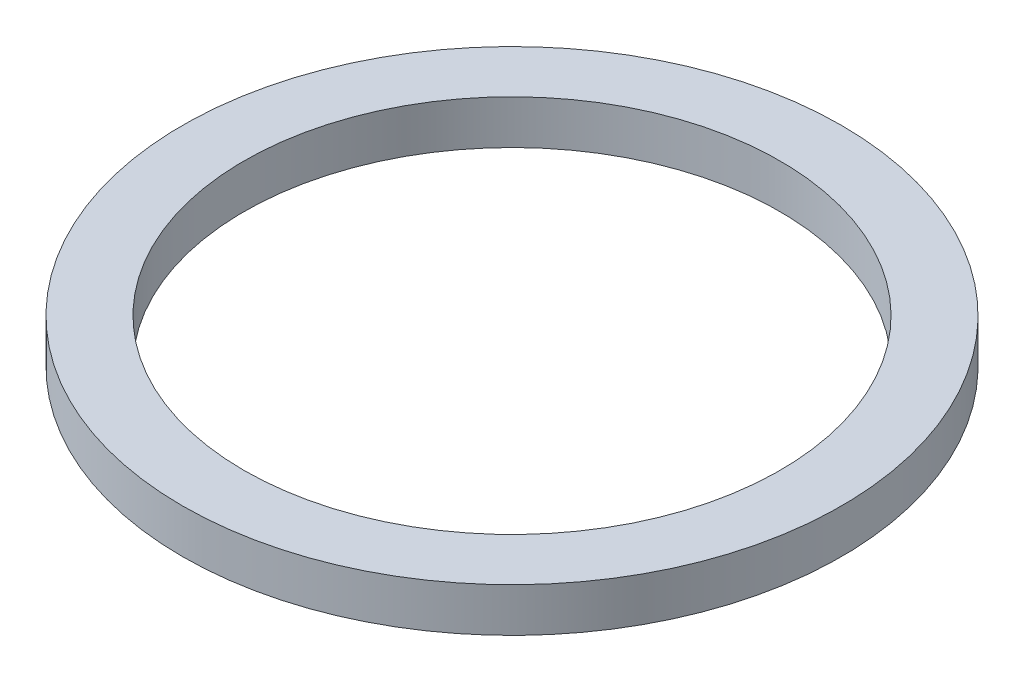
ISO-10303-21;
HEADER;
FILE_DESCRIPTION(('STEP AP214'),'2;1');
FILE_NAME('part.step','',(''),(''),'','','');
FILE_SCHEMA(('AUTOMOTIVE_DESIGN { 1 0 10303 214 1 1 1 1 }'));
ENDSEC;
DATA;
#1=APPLICATION_CONTEXT('core data for automotive mechanical design processes');
#2=APPLICATION_PROTOCOL_DEFINITION('international standard','automotive_design',2000,#1);
#3=PRODUCT_CONTEXT('',#1,'mechanical');
#4=PRODUCT('Part','Part','',(#3));
#5=PRODUCT_RELATED_PRODUCT_CATEGORY('part','',(#4));
#6=PRODUCT_DEFINITION_FORMATION('','',#4);
#7=PRODUCT_DEFINITION_CONTEXT('part definition',#1,'design');
#8=PRODUCT_DEFINITION('design','',#6,#7);
#9=PRODUCT_DEFINITION_SHAPE('','',#8);
#10=(LENGTH_UNIT() NAMED_UNIT(*) SI_UNIT(.MILLI.,.METRE.));
#11=(NAMED_UNIT(*) PLANE_ANGLE_UNIT() SI_UNIT($,.RADIAN.));
#12=(NAMED_UNIT(*) SI_UNIT($,.STERADIAN.) SOLID_ANGLE_UNIT());
#13=UNCERTAINTY_MEASURE_WITH_UNIT(LENGTH_MEASURE(1.E-05),#10,'distance_accuracy_value','');
#14=(GEOMETRIC_REPRESENTATION_CONTEXT(3) GLOBAL_UNCERTAINTY_ASSIGNED_CONTEXT((#13)) GLOBAL_UNIT_ASSIGNED_CONTEXT((#10,
#11,#12)) REPRESENTATION_CONTEXT('',''));
#15=CARTESIAN_POINT('',(0.,0.,0.));
#16=DIRECTION('',(0.,0.,1.));
#17=DIRECTION('',(1.,0.,0.));
#18=AXIS2_PLACEMENT_3D('',#15,#16,#17);
#19=CARTESIAN_POINT('',(0.,0.,0.));
#20=DIRECTION('',(0.,1.,0.));
#21=DIRECTION('',(0.,0.,1.));
#22=AXIS2_PLACEMENT_3D('',#19,#20,#21);
#23=CYLINDRICAL_SURFACE('',#22,7.5);
#24=CARTESIAN_POINT('',(0.,0.,0.));
#25=DIRECTION('',(0.,1.,0.));
#26=DIRECTION('',(0.,0.,1.));
#27=AXIS2_PLACEMENT_3D('',#24,#25,#26);
#28=CIRCLE('',#27,7.5);
#29=CARTESIAN_POINT('',(0.,0.,7.5));
#30=VERTEX_POINT('',#29);
#31=EDGE_CURVE('E10',#30,#30,#28,.T.);
#32=ORIENTED_EDGE('',*,*,#31,.T.);
#33=EDGE_LOOP('',(#32));
#34=FACE_BOUND('',#33,.T.);
#35=CARTESIAN_POINT('',(0.,1.,0.));
#36=DIRECTION('',(0.,1.,0.));
#37=DIRECTION('',(0.,0.,1.));
#38=AXIS2_PLACEMENT_3D('',#35,#36,#37);
#39=CIRCLE('',#38,7.5);
#40=CARTESIAN_POINT('',(0.,1.,7.5));
#41=VERTEX_POINT('',#40);
#42=EDGE_CURVE('E45',#41,#41,#39,.T.);
#43=ORIENTED_EDGE('',*,*,#42,.F.);
#44=EDGE_LOOP('',(#43));
#45=FACE_BOUND('',#44,.T.);
#46=ADVANCED_FACE('F31',(#34,#45),#23,.T.);
#47=CARTESIAN_POINT('',(-7.5,0.,0.));
#48=DIRECTION('',(0.,-1.,0.));
#49=DIRECTION('',(0.,0.,-1.));
#50=AXIS2_PLACEMENT_3D('',#47,#48,#49);
#51=PLANE('',#50);
#52=CARTESIAN_POINT('',(0.,0.,0.));
#53=DIRECTION('',(0.,1.,0.));
#54=DIRECTION('',(0.,0.,1.));
#55=AXIS2_PLACEMENT_3D('',#52,#53,#54);
#56=CIRCLE('',#55,6.1);
#57=CARTESIAN_POINT('',(0.,0.,6.1));
#58=VERTEX_POINT('',#57);
#59=EDGE_CURVE('E37',#58,#58,#56,.T.);
#60=ORIENTED_EDGE('',*,*,#59,.T.);
#61=EDGE_LOOP('',(#60));
#62=FACE_BOUND('',#61,.T.);
#63=ORIENTED_EDGE('',*,*,#31,.F.);
#64=EDGE_LOOP('',(#63));
#65=FACE_BOUND('',#64,.T.);
#66=ADVANCED_FACE('F55',(#62,#65),#51,.T.);
#67=CARTESIAN_POINT('',(0.,0.,0.));
#68=DIRECTION('',(0.,1.,0.));
#69=DIRECTION('',(0.,0.,1.));
#70=AXIS2_PLACEMENT_3D('',#67,#68,#69);
#71=CYLINDRICAL_SURFACE('',#70,6.1);
#72=CARTESIAN_POINT('',(0.,1.,0.));
#73=DIRECTION('',(0.,1.,0.));
#74=DIRECTION('',(0.,0.,1.));
#75=AXIS2_PLACEMENT_3D('',#72,#73,#74);
#76=CIRCLE('',#75,6.1);
#77=CARTESIAN_POINT('',(0.,1.,6.1));
#78=VERTEX_POINT('',#77);
#79=EDGE_CURVE('E41',#78,#78,#76,.T.);
#80=ORIENTED_EDGE('',*,*,#79,.T.);
#81=EDGE_LOOP('',(#80));
#82=FACE_BOUND('',#81,.T.);
#83=ORIENTED_EDGE('',*,*,#59,.F.);
#84=EDGE_LOOP('',(#83));
#85=FACE_BOUND('',#84,.T.);
#86=ADVANCED_FACE('F59',(#82,#85),#71,.F.);
#87=CARTESIAN_POINT('',(-7.5,1.,0.));
#88=DIRECTION('',(0.,1.,0.));
#89=DIRECTION('',(0.,0.,1.));
#90=AXIS2_PLACEMENT_3D('',#87,#88,#89);
#91=PLANE('',#90);
#92=ORIENTED_EDGE('',*,*,#42,.T.);
#93=EDGE_LOOP('',(#92));
#94=FACE_BOUND('',#93,.T.);
#95=ORIENTED_EDGE('',*,*,#79,.F.);
#96=EDGE_LOOP('',(#95));
#97=FACE_BOUND('',#96,.T.);
#98=ADVANCED_FACE('F51',(#94,#97),#91,.T.);
#99=CLOSED_SHELL('',(#46,#66,#86,#98));
#100=MANIFOLD_SOLID_BREP('B2',#99);
#101=ADVANCED_BREP_SHAPE_REPRESENTATION('',(#18,#100),#14);
#102=SHAPE_DEFINITION_REPRESENTATION(#9,#101);
ENDSEC;
END-ISO-10303-21;
